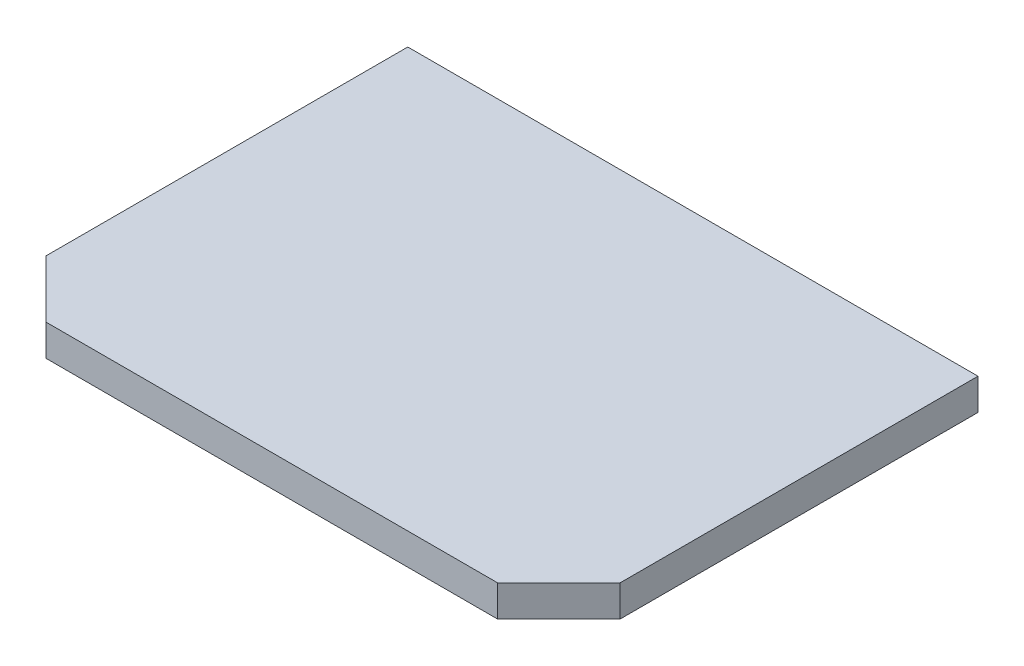
ISO-10303-21;
HEADER;
FILE_DESCRIPTION(('STEP AP214'),'2;1');
FILE_NAME('part.step','',(''),(''),'','','');
FILE_SCHEMA(('AUTOMOTIVE_DESIGN { 1 0 10303 214 1 1 1 1 }'));
ENDSEC;
DATA;
#1=APPLICATION_CONTEXT('core data for automotive mechanical design processes');
#2=APPLICATION_PROTOCOL_DEFINITION('international standard','automotive_design',2000,#1);
#3=PRODUCT_CONTEXT('',#1,'mechanical');
#4=PRODUCT('Part','Part','',(#3));
#5=PRODUCT_RELATED_PRODUCT_CATEGORY('part','',(#4));
#6=PRODUCT_DEFINITION_FORMATION('','',#4);
#7=PRODUCT_DEFINITION_CONTEXT('part definition',#1,'design');
#8=PRODUCT_DEFINITION('design','',#6,#7);
#9=PRODUCT_DEFINITION_SHAPE('','',#8);
#10=(LENGTH_UNIT() NAMED_UNIT(*) SI_UNIT(.MILLI.,.METRE.));
#11=(NAMED_UNIT(*) PLANE_ANGLE_UNIT() SI_UNIT($,.RADIAN.));
#12=(NAMED_UNIT(*) SI_UNIT($,.STERADIAN.) SOLID_ANGLE_UNIT());
#13=UNCERTAINTY_MEASURE_WITH_UNIT(LENGTH_MEASURE(1.E-05),#10,'distance_accuracy_value','');
#14=(GEOMETRIC_REPRESENTATION_CONTEXT(3) GLOBAL_UNCERTAINTY_ASSIGNED_CONTEXT((#13)) GLOBAL_UNIT_ASSIGNED_CONTEXT((#10,
#11,#12)) REPRESENTATION_CONTEXT('',''));
#15=CARTESIAN_POINT('',(0.,0.,0.));
#16=DIRECTION('',(0.,0.,1.));
#17=DIRECTION('',(1.,0.,0.));
#18=AXIS2_PLACEMENT_3D('',#15,#16,#17);
#19=CARTESIAN_POINT('',(-16.127330454661,1.39882293722681E-13,-12.));
#20=DIRECTION('',(-1.,0.,0.));
#21=DIRECTION('',(0.,-1.,0.));
#22=AXIS2_PLACEMENT_3D('',#19,#20,#21);
#23=PLANE('',#22);
#24=DIRECTION('',(0.,0.,1.));
#25=VECTOR('',#24,1.);
#26=CARTESIAN_POINT('',(-16.127330454661,3.2,-12.));
#27=LINE('',#26,#25);
#28=CARTESIAN_POINT('',(-16.127330454661,3.2,-12.));
#29=VERTEX_POINT('',#28);
#30=CARTESIAN_POINT('',(-16.127330454661,3.2,5.124133230369));
#31=VERTEX_POINT('',#30);
#32=EDGE_CURVE('E214',#29,#31,#27,.T.);
#33=ORIENTED_EDGE('',*,*,#32,.T.);
#34=DIRECTION('',(0.,-1.,0.));
#35=VECTOR('',#34,1.);
#36=CARTESIAN_POINT('',(-16.127330454661,1.46050094247165E-13,5.124133230369));
#37=LINE('',#36,#35);
#38=CARTESIAN_POINT('',(-16.127330454661,4.,5.124133230369));
#39=VERTEX_POINT('',#38);
#40=EDGE_CURVE('E171',#39,#31,#37,.T.);
#41=ORIENTED_EDGE('',*,*,#40,.F.);
#42=DIRECTION('',(0.,0.,1.));
#43=VECTOR('',#42,1.);
#44=CARTESIAN_POINT('',(-16.127330454661,4.,-12.));
#45=LINE('',#44,#43);
#46=CARTESIAN_POINT('',(-16.127330454661,4.,-12.));
#47=VERTEX_POINT('',#46);
#48=EDGE_CURVE('E58',#47,#39,#45,.T.);
#49=ORIENTED_EDGE('',*,*,#48,.F.);
#50=DIRECTION('',(0.,-1.,0.));
#51=VECTOR('',#50,1.);
#52=CARTESIAN_POINT('',(-16.127330454661,1.39882293722681E-13,-12.));
#53=LINE('',#52,#51);
#54=EDGE_CURVE('E170',#47,#29,#53,.T.);
#55=ORIENTED_EDGE('',*,*,#54,.T.);
#56=EDGE_LOOP('',(#33,#41,#49,#55));
#57=FACE_BOUND('',#56,.T.);
#58=ADVANCED_FACE('F36',(#57),#23,.T.);
#59=CARTESIAN_POINT('',(0.,4.,-12.));
#60=DIRECTION('',(0.,1.,0.));
#61=DIRECTION('',(0.,0.,1.));
#62=AXIS2_PLACEMENT_3D('',#59,#60,#61);
#63=PLANE('',#62);
#64=ORIENTED_EDGE('',*,*,#48,.T.);
#65=DIRECTION('',(-1.,0.,0.));
#66=VECTOR('',#65,1.);
#67=CARTESIAN_POINT('',(0.,4.,5.124133230369));
#68=LINE('',#67,#66);
#69=CARTESIAN_POINT('',(-11.027330454661,4.,5.124133230369));
#70=VERTEX_POINT('',#69);
#71=EDGE_CURVE('E175',#70,#39,#68,.T.);
#72=ORIENTED_EDGE('',*,*,#71,.F.);
#73=DIRECTION('',(0.,0.,1.));
#74=VECTOR('',#73,1.);
#75=CARTESIAN_POINT('',(-11.027330454661,4.,-12.));
#76=LINE('',#75,#74);
#77=CARTESIAN_POINT('',(-11.027330454661,4.,-12.));
#78=VERTEX_POINT('',#77);
#79=EDGE_CURVE('E216',#78,#70,#76,.T.);
#80=ORIENTED_EDGE('',*,*,#79,.F.);
#81=DIRECTION('',(-1.,0.,0.));
#82=VECTOR('',#81,1.);
#83=CARTESIAN_POINT('',(0.,4.,-12.));
#84=LINE('',#83,#82);
#85=EDGE_CURVE('E211',#78,#47,#84,.T.);
#86=ORIENTED_EDGE('',*,*,#85,.T.);
#87=EDGE_LOOP('',(#64,#72,#80,#86));
#88=FACE_BOUND('',#87,.T.);
#89=ADVANCED_FACE('F292',(#88),#63,.T.);
#90=CARTESIAN_POINT('',(-11.027330454661,0.,-12.));
#91=DIRECTION('',(-1.,0.,0.));
#92=DIRECTION('',(0.,0.,1.));
#93=AXIS2_PLACEMENT_3D('',#90,#91,#92);
#94=PLANE('',#93);
#95=ORIENTED_EDGE('',*,*,#79,.T.);
#96=DIRECTION('',(0.,-1.,0.));
#97=VECTOR('',#96,1.);
#98=CARTESIAN_POINT('',(-11.027330454661,0.,5.124133230369));
#99=LINE('',#98,#97);
#100=CARTESIAN_POINT('',(-11.027330454661,5.1,5.124133230369));
#101=VERTEX_POINT('',#100);
#102=EDGE_CURVE('E167',#101,#70,#99,.T.);
#103=ORIENTED_EDGE('',*,*,#102,.F.);
#104=DIRECTION('',(0.,0.,1.));
#105=VECTOR('',#104,1.);
#106=CARTESIAN_POINT('',(-11.027330454661,5.1,-12.));
#107=LINE('',#106,#105);
#108=CARTESIAN_POINT('',(-11.027330454661,5.1,-12.));
#109=VERTEX_POINT('',#108);
#110=EDGE_CURVE('E218',#109,#101,#107,.T.);
#111=ORIENTED_EDGE('',*,*,#110,.F.);
#112=DIRECTION('',(0.,-1.,0.));
#113=VECTOR('',#112,1.);
#114=CARTESIAN_POINT('',(-11.027330454661,0.,-12.));
#115=LINE('',#114,#113);
#116=EDGE_CURVE('E208',#109,#78,#115,.T.);
#117=ORIENTED_EDGE('',*,*,#116,.T.);
#118=EDGE_LOOP('',(#95,#103,#111,#117));
#119=FACE_BOUND('',#118,.T.);
#120=ADVANCED_FACE('F261',(#119),#94,.T.);
#121=CARTESIAN_POINT('',(0.,5.1,-12.));
#122=DIRECTION('',(0.,1.,0.));
#123=DIRECTION('',(0.,0.,1.));
#124=AXIS2_PLACEMENT_3D('',#121,#122,#123);
#125=PLANE('',#124);
#126=DIRECTION('',(-1.,0.,0.));
#127=VECTOR('',#126,1.);
#128=CARTESIAN_POINT('',(0.,5.1,14.703327406655));
#129=LINE('',#128,#127);
#130=CARTESIAN_POINT('',(14.191406072396,5.1,14.703327406655));
#131=VERTEX_POINT('',#130);
#132=CARTESIAN_POINT('',(-14.5724068344093,5.1,14.703327406655));
#133=VERTEX_POINT('',#132);
#134=EDGE_CURVE('E139',#131,#133,#129,.T.);
#135=ORIENTED_EDGE('',*,*,#134,.T.);
#136=DIRECTION('',(-0.707106781186548,0.,-0.707106781186547));
#137=VECTOR('',#136,1.);
#138=CARTESIAN_POINT('',(-20.6378671205321,5.1,8.63786712053215));
#139=LINE('',#138,#137);
#140=CARTESIAN_POINT('',(-18.227330454661,5.1,11.0484037864033));
#141=VERTEX_POINT('',#140);
#142=EDGE_CURVE('E147',#133,#141,#139,.T.);
#143=ORIENTED_EDGE('',*,*,#142,.T.);
#144=DIRECTION('',(0.,0.,1.));
#145=VECTOR('',#144,1.);
#146=CARTESIAN_POINT('',(-18.227330454661,5.1,-12.));
#147=LINE('',#146,#145);
#148=CARTESIAN_POINT('',(-18.227330454661,5.1,-12.));
#149=VERTEX_POINT('',#148);
#150=EDGE_CURVE('E221',#149,#141,#147,.T.);
#151=ORIENTED_EDGE('',*,*,#150,.F.);
#152=DIRECTION('',(-1.,0.,0.));
#153=VECTOR('',#152,1.);
#154=CARTESIAN_POINT('',(0.,5.1,-12.));
#155=LINE('',#154,#153);
#156=EDGE_CURVE('E206',#109,#149,#155,.T.);
#157=ORIENTED_EDGE('',*,*,#156,.F.);
#158=ORIENTED_EDGE('',*,*,#110,.T.);
#159=DIRECTION('',(1.,0.,0.));
#160=VECTOR('',#159,1.);
#161=CARTESIAN_POINT('',(11.027330454661,5.1,5.124133230369));
#162=LINE('',#161,#160);
#163=CARTESIAN_POINT('',(11.027330454661,5.1,5.124133230369));
#164=VERTEX_POINT('',#163);
#165=EDGE_CURVE('E164',#101,#164,#162,.T.);
#166=ORIENTED_EDGE('',*,*,#165,.T.);
#167=DIRECTION('',(0.,0.,1.));
#168=VECTOR('',#167,1.);
#169=CARTESIAN_POINT('',(11.027330454661,5.1,-12.));
#170=LINE('',#169,#168);
#171=CARTESIAN_POINT('',(11.027330454661,5.1,-12.));
#172=VERTEX_POINT('',#171);
#173=EDGE_CURVE('E228',#172,#164,#170,.T.);
#174=ORIENTED_EDGE('',*,*,#173,.F.);
#175=DIRECTION('',(-1.,0.,0.));
#176=VECTOR('',#175,1.);
#177=CARTESIAN_POINT('',(0.,5.1,-12.));
#178=LINE('',#177,#176);
#179=CARTESIAN_POINT('',(18.10033020066,5.1,-12.));
#180=VERTEX_POINT('',#179);
#181=EDGE_CURVE('E197',#180,#172,#178,.T.);
#182=ORIENTED_EDGE('',*,*,#181,.F.);
#183=DIRECTION('',(0.,0.,1.));
#184=VECTOR('',#183,1.);
#185=CARTESIAN_POINT('',(18.10033020066,5.1,-12.));
#186=LINE('',#185,#184);
#187=CARTESIAN_POINT('',(18.10033020066,5.1,10.7944032784056));
#188=VERTEX_POINT('',#187);
#189=EDGE_CURVE('E50',#180,#188,#186,.T.);
#190=ORIENTED_EDGE('',*,*,#189,.T.);
#191=DIRECTION('',(-0.707106781187862,0.,0.707106781185233));
#192=VECTOR('',#191,1.);
#193=CARTESIAN_POINT('',(20.4473667394991,5.1,8.44736673957516));
#194=LINE('',#193,#192);
#195=EDGE_CURVE('E148',#188,#131,#194,.T.);
#196=ORIENTED_EDGE('',*,*,#195,.T.);
#197=EDGE_LOOP('',(#135,#143,#151,#157,#158,#166,#174,#182,#190,#196));
#198=FACE_BOUND('',#197,.T.);
#199=ADVANCED_FACE('F157',(#198),#125,.F.);
#200=CARTESIAN_POINT('',(-18.227330454661,0.,-12.));
#201=DIRECTION('',(1.,0.,0.));
#202=DIRECTION('',(0.,0.,-1.));
#203=AXIS2_PLACEMENT_3D('',#200,#201,#202);
#204=PLANE('',#203);
#205=DIRECTION('',(0.,1.,0.));
#206=VECTOR('',#205,1.);
#207=CARTESIAN_POINT('',(-18.227330454661,3.2,11.0484037864033));
#208=LINE('',#207,#206);
#209=CARTESIAN_POINT('',(-18.227330454661,7.1,11.0484037864033));
#210=VERTEX_POINT('',#209);
#211=EDGE_CURVE('E159',#141,#210,#208,.T.);
#212=ORIENTED_EDGE('',*,*,#211,.T.);
#213=DIRECTION('',(0.,0.,1.));
#214=VECTOR('',#213,1.);
#215=CARTESIAN_POINT('',(-18.227330454661,7.1,-12.));
#216=LINE('',#215,#214);
#217=CARTESIAN_POINT('',(-18.227330454661,7.1,-12.));
#218=VERTEX_POINT('',#217);
#219=EDGE_CURVE('E223',#218,#210,#216,.T.);
#220=ORIENTED_EDGE('',*,*,#219,.F.);
#221=DIRECTION('',(0.,1.,0.));
#222=VECTOR('',#221,1.);
#223=CARTESIAN_POINT('',(-18.227330454661,0.,-12.));
#224=LINE('',#223,#222);
#225=EDGE_CURVE('E204',#149,#218,#224,.T.);
#226=ORIENTED_EDGE('',*,*,#225,.F.);
#227=ORIENTED_EDGE('',*,*,#150,.T.);
#228=EDGE_LOOP('',(#212,#220,#226,#227));
#229=FACE_BOUND('',#228,.T.);
#230=ADVANCED_FACE('F250',(#229),#204,.F.);
#231=CARTESIAN_POINT('',(0.,7.1,-12.));
#232=DIRECTION('',(0.,-1.,0.));
#233=DIRECTION('',(0.,0.,-1.));
#234=AXIS2_PLACEMENT_3D('',#231,#232,#233);
#235=PLANE('',#234);
#236=ORIENTED_EDGE('',*,*,#219,.T.);
#237=DIRECTION('',(0.707106781186548,0.,0.707106781186547));
#238=VECTOR('',#237,1.);
#239=CARTESIAN_POINT('',(-20.6378671205321,7.1,8.63786712053215));
#240=LINE('',#239,#238);
#241=CARTESIAN_POINT('',(-14.5724068344093,7.1,14.703327406655));
#242=VERTEX_POINT('',#241);
#243=EDGE_CURVE('E12',#210,#242,#240,.T.);
#244=ORIENTED_EDGE('',*,*,#243,.T.);
#245=DIRECTION('',(1.,0.,0.));
#246=VECTOR('',#245,1.);
#247=CARTESIAN_POINT('',(0.,7.1,14.703327406655));
#248=LINE('',#247,#246);
#249=CARTESIAN_POINT('',(14.191406072396,7.1,14.703327406655));
#250=VERTEX_POINT('',#249);
#251=EDGE_CURVE('E43',#242,#250,#248,.T.);
#252=ORIENTED_EDGE('',*,*,#251,.T.);
#253=DIRECTION('',(0.707106781187862,0.,-0.707106781185233));
#254=VECTOR('',#253,1.);
#255=CARTESIAN_POINT('',(20.4473667394991,7.1,8.44736673957516));
#256=LINE('',#255,#254);
#257=CARTESIAN_POINT('',(18.10033020066,7.1,10.7944032784056));
#258=VERTEX_POINT('',#257);
#259=EDGE_CURVE('E155',#250,#258,#256,.T.);
#260=ORIENTED_EDGE('',*,*,#259,.T.);
#261=DIRECTION('',(0.,0.,1.));
#262=VECTOR('',#261,1.);
#263=CARTESIAN_POINT('',(18.10033020066,7.1,-12.));
#264=LINE('',#263,#262);
#265=CARTESIAN_POINT('',(18.10033020066,7.1,-12.));
#266=VERTEX_POINT('',#265);
#267=EDGE_CURVE('E225',#266,#258,#264,.T.);
#268=ORIENTED_EDGE('',*,*,#267,.F.);
#269=DIRECTION('',(1.,0.,0.));
#270=VECTOR('',#269,1.);
#271=CARTESIAN_POINT('',(0.,7.1,-12.));
#272=LINE('',#271,#270);
#273=EDGE_CURVE('E202',#218,#266,#272,.T.);
#274=ORIENTED_EDGE('',*,*,#273,.F.);
#275=EDGE_LOOP('',(#236,#244,#252,#260,#268,#274));
#276=FACE_BOUND('',#275,.T.);
#277=ADVANCED_FACE('F239',(#276),#235,.F.);
#278=CARTESIAN_POINT('',(18.10033020066,0.,-12.));
#279=DIRECTION('',(1.,0.,0.));
#280=DIRECTION('',(0.,0.,-1.));
#281=AXIS2_PLACEMENT_3D('',#278,#279,#280);
#282=PLANE('',#281);
#283=DIRECTION('',(0.,1.,0.));
#284=VECTOR('',#283,1.);
#285=CARTESIAN_POINT('',(18.10033020066,0.,10.7944032784056));
#286=LINE('',#285,#284);
#287=EDGE_CURVE('E166',#188,#258,#286,.T.);
#288=ORIENTED_EDGE('',*,*,#287,.F.);
#289=ORIENTED_EDGE('',*,*,#189,.F.);
#290=DIRECTION('',(0.,1.,0.));
#291=VECTOR('',#290,1.);
#292=CARTESIAN_POINT('',(18.10033020066,0.,-12.));
#293=LINE('',#292,#291);
#294=EDGE_CURVE('E199',#180,#266,#293,.T.);
#295=ORIENTED_EDGE('',*,*,#294,.T.);
#296=ORIENTED_EDGE('',*,*,#267,.T.);
#297=EDGE_LOOP('',(#288,#289,#295,#296));
#298=FACE_BOUND('',#297,.T.);
#299=ADVANCED_FACE('F282',(#298),#282,.T.);
#300=CARTESIAN_POINT('',(11.027330454661,0.,-12.));
#301=DIRECTION('',(-1.,0.,0.));
#302=DIRECTION('',(0.,0.,1.));
#303=AXIS2_PLACEMENT_3D('',#300,#301,#302);
#304=PLANE('',#303);
#305=ORIENTED_EDGE('',*,*,#173,.T.);
#306=DIRECTION('',(0.,-1.,0.));
#307=VECTOR('',#306,1.);
#308=CARTESIAN_POINT('',(11.027330454661,0.,5.124133230369));
#309=LINE('',#308,#307);
#310=CARTESIAN_POINT('',(11.027330454661,4.,5.124133230369));
#311=VERTEX_POINT('',#310);
#312=EDGE_CURVE('E172',#164,#311,#309,.T.);
#313=ORIENTED_EDGE('',*,*,#312,.T.);
#314=DIRECTION('',(0.,0.,1.));
#315=VECTOR('',#314,1.);
#316=CARTESIAN_POINT('',(11.027330454661,4.,-12.));
#317=LINE('',#316,#315);
#318=CARTESIAN_POINT('',(11.027330454661,4.,-12.));
#319=VERTEX_POINT('',#318);
#320=EDGE_CURVE('E231',#319,#311,#317,.T.);
#321=ORIENTED_EDGE('',*,*,#320,.F.);
#322=DIRECTION('',(0.,-1.,0.));
#323=VECTOR('',#322,1.);
#324=CARTESIAN_POINT('',(11.027330454661,0.,-12.));
#325=LINE('',#324,#323);
#326=EDGE_CURVE('E195',#172,#319,#325,.T.);
#327=ORIENTED_EDGE('',*,*,#326,.F.);
#328=EDGE_LOOP('',(#305,#313,#321,#327));
#329=FACE_BOUND('',#328,.T.);
#330=ADVANCED_FACE('F269',(#329),#304,.F.);
#331=CARTESIAN_POINT('',(0.,4.,-12.));
#332=DIRECTION('',(0.,-1.,0.));
#333=DIRECTION('',(0.,0.,-1.));
#334=AXIS2_PLACEMENT_3D('',#331,#332,#333);
#335=PLANE('',#334);
#336=ORIENTED_EDGE('',*,*,#320,.T.);
#337=DIRECTION('',(1.,0.,0.));
#338=VECTOR('',#337,1.);
#339=CARTESIAN_POINT('',(0.,4.,5.124133230369));
#340=LINE('',#339,#338);
#341=CARTESIAN_POINT('',(16.1277581912354,4.,5.124133230369));
#342=VERTEX_POINT('',#341);
#343=EDGE_CURVE('E176',#311,#342,#340,.T.);
#344=ORIENTED_EDGE('',*,*,#343,.T.);
#345=DIRECTION('',(0.,0.,1.));
#346=VECTOR('',#345,1.);
#347=CARTESIAN_POINT('',(16.1277581912354,4.,-12.));
#348=LINE('',#347,#346);
#349=CARTESIAN_POINT('',(16.1277581912354,4.,-12.));
#350=VERTEX_POINT('',#349);
#351=EDGE_CURVE('E233',#350,#342,#348,.T.);
#352=ORIENTED_EDGE('',*,*,#351,.F.);
#353=DIRECTION('',(1.,0.,0.));
#354=VECTOR('',#353,1.);
#355=CARTESIAN_POINT('',(0.,4.,-12.));
#356=LINE('',#355,#354);
#357=EDGE_CURVE('E193',#319,#350,#356,.T.);
#358=ORIENTED_EDGE('',*,*,#357,.F.);
#359=EDGE_LOOP('',(#336,#344,#352,#358));
#360=FACE_BOUND('',#359,.T.);
#361=ADVANCED_FACE('F277',(#360),#335,.F.);
#362=CARTESIAN_POINT('',(16.1277581912354,0.,-12.));
#363=DIRECTION('',(-1.,0.,0.));
#364=DIRECTION('',(0.,0.,1.));
#365=AXIS2_PLACEMENT_3D('',#362,#363,#364);
#366=PLANE('',#365);
#367=ORIENTED_EDGE('',*,*,#351,.T.);
#368=DIRECTION('',(0.,-1.,0.));
#369=VECTOR('',#368,1.);
#370=CARTESIAN_POINT('',(16.1277581912354,0.,5.124133230369));
#371=LINE('',#370,#369);
#372=CARTESIAN_POINT('',(16.1277581912354,3.20000006895067,5.124133230369));
#373=VERTEX_POINT('',#372);
#374=EDGE_CURVE('E179',#342,#373,#371,.T.);
#375=ORIENTED_EDGE('',*,*,#374,.T.);
#376=DIRECTION('',(0.,0.,1.));
#377=VECTOR('',#376,1.);
#378=CARTESIAN_POINT('',(16.1277581912354,3.20000006895067,-12.));
#379=LINE('',#378,#377);
#380=CARTESIAN_POINT('',(16.1277581912354,3.20000006895067,-12.));
#381=VERTEX_POINT('',#380);
#382=EDGE_CURVE('E235',#381,#373,#379,.T.);
#383=ORIENTED_EDGE('',*,*,#382,.F.);
#384=DIRECTION('',(0.,-1.,0.));
#385=VECTOR('',#384,1.);
#386=CARTESIAN_POINT('',(16.1277581912354,0.,-12.));
#387=LINE('',#386,#385);
#388=EDGE_CURVE('E191',#350,#381,#387,.T.);
#389=ORIENTED_EDGE('',*,*,#388,.F.);
#390=EDGE_LOOP('',(#367,#375,#383,#389));
#391=FACE_BOUND('',#390,.T.);
#392=ADVANCED_FACE('F303',(#391),#366,.F.);
#393=CARTESIAN_POINT('',(0.,3.2,-12.));
#394=DIRECTION('',(0.,1.,0.));
#395=DIRECTION('',(-1.,0.,0.));
#396=AXIS2_PLACEMENT_3D('',#393,#394,#395);
#397=PLANE('',#396);
#398=ORIENTED_EDGE('',*,*,#382,.T.);
#399=DIRECTION('',(-1.,0.,0.));
#400=VECTOR('',#399,1.);
#401=CARTESIAN_POINT('',(0.,3.2,5.124133230369));
#402=LINE('',#401,#400);
#403=EDGE_CURVE('E163',#373,#31,#402,.T.);
#404=ORIENTED_EDGE('',*,*,#403,.T.);
#405=ORIENTED_EDGE('',*,*,#32,.F.);
#406=DIRECTION('',(-1.,0.,0.));
#407=VECTOR('',#406,1.);
#408=CARTESIAN_POINT('',(0.,3.2,-12.));
#409=LINE('',#408,#407);
#410=EDGE_CURVE('E189',#381,#29,#409,.T.);
#411=ORIENTED_EDGE('',*,*,#410,.F.);
#412=EDGE_LOOP('',(#398,#404,#405,#411));
#413=FACE_BOUND('',#412,.T.);
#414=ADVANCED_FACE('F301',(#413),#397,.F.);
#415=CARTESIAN_POINT('',(0.,0.,-12.));
#416=DIRECTION('',(0.,0.,1.));
#417=DIRECTION('',(1.,0.,0.));
#418=AXIS2_PLACEMENT_3D('',#415,#416,#417);
#419=PLANE('',#418);
#420=ORIENTED_EDGE('',*,*,#54,.F.);
#421=ORIENTED_EDGE('',*,*,#85,.F.);
#422=ORIENTED_EDGE('',*,*,#116,.F.);
#423=ORIENTED_EDGE('',*,*,#156,.T.);
#424=ORIENTED_EDGE('',*,*,#225,.T.);
#425=ORIENTED_EDGE('',*,*,#273,.T.);
#426=ORIENTED_EDGE('',*,*,#294,.F.);
#427=ORIENTED_EDGE('',*,*,#181,.T.);
#428=ORIENTED_EDGE('',*,*,#326,.T.);
#429=ORIENTED_EDGE('',*,*,#357,.T.);
#430=ORIENTED_EDGE('',*,*,#388,.T.);
#431=ORIENTED_EDGE('',*,*,#410,.T.);
#432=EDGE_LOOP('',(#420,#421,#422,#423,#424,#425,#426,#427,#428,#429,#430,#431));
#433=FACE_BOUND('',#432,.T.);
#434=ADVANCED_FACE('F257',(#433),#419,.F.);
#435=CARTESIAN_POINT('',(4.209296418593,4.675627600025,5.124133230369));
#436=DIRECTION('',(0.,0.,1.));
#437=DIRECTION('',(-1.,0.,0.));
#438=AXIS2_PLACEMENT_3D('',#435,#436,#437);
#439=PLANE('',#438);
#440=ORIENTED_EDGE('',*,*,#165,.F.);
#441=ORIENTED_EDGE('',*,*,#102,.T.);
#442=ORIENTED_EDGE('',*,*,#71,.T.);
#443=ORIENTED_EDGE('',*,*,#40,.T.);
#444=ORIENTED_EDGE('',*,*,#403,.F.);
#445=ORIENTED_EDGE('',*,*,#374,.F.);
#446=ORIENTED_EDGE('',*,*,#343,.F.);
#447=ORIENTED_EDGE('',*,*,#312,.F.);
#448=EDGE_LOOP('',(#440,#441,#442,#443,#444,#445,#446,#447));
#449=FACE_BOUND('',#448,.T.);
#450=ADVANCED_FACE('F272',(#449),#439,.T.);
#451=CARTESIAN_POINT('',(-14.6378671205321,3.2,14.6378671205321));
#452=DIRECTION('',(0.707106781186547,0.,-0.707106781186548));
#453=DIRECTION('',(-0.707106781186548,0.,-0.707106781186547));
#454=AXIS2_PLACEMENT_3D('',#451,#452,#453);
#455=PLANE('',#454);
#456=DIRECTION('',(0.,1.,0.));
#457=VECTOR('',#456,1.);
#458=CARTESIAN_POINT('',(-14.5724068344093,3.2,14.703327406655));
#459=LINE('',#458,#457);
#460=EDGE_CURVE('E145',#133,#242,#459,.T.);
#461=ORIENTED_EDGE('',*,*,#460,.T.);
#462=ORIENTED_EDGE('',*,*,#243,.F.);
#463=ORIENTED_EDGE('',*,*,#211,.F.);
#464=ORIENTED_EDGE('',*,*,#142,.F.);
#465=EDGE_LOOP('',(#461,#462,#463,#464));
#466=FACE_BOUND('',#465,.T.);
#467=ADVANCED_FACE('F243',(#466),#455,.F.);
#468=CARTESIAN_POINT('',(0.,3.2,14.703327406655));
#469=DIRECTION('',(0.,0.,-1.));
#470=DIRECTION('',(-1.,0.,0.));
#471=AXIS2_PLACEMENT_3D('',#468,#469,#470);
#472=PLANE('',#471);
#473=DIRECTION('',(0.,1.,0.));
#474=VECTOR('',#473,1.);
#475=CARTESIAN_POINT('',(14.191406072396,3.2,14.703327406655));
#476=LINE('',#475,#474);
#477=EDGE_CURVE('E142',#131,#250,#476,.T.);
#478=ORIENTED_EDGE('',*,*,#477,.T.);
#479=ORIENTED_EDGE('',*,*,#251,.F.);
#480=ORIENTED_EDGE('',*,*,#460,.F.);
#481=ORIENTED_EDGE('',*,*,#134,.F.);
#482=EDGE_LOOP('',(#478,#479,#480,#481));
#483=FACE_BOUND('',#482,.T.);
#484=ADVANCED_FACE('F141',(#483),#472,.F.);
#485=CARTESIAN_POINT('',(14.4473667394991,3.2,14.4473667395528));
#486=DIRECTION('',(-0.707106781185233,0.,-0.707106781187862));
#487=DIRECTION('',(-0.707106781187862,0.,0.707106781185233));
#488=AXIS2_PLACEMENT_3D('',#485,#486,#487);
#489=PLANE('',#488);
#490=ORIENTED_EDGE('',*,*,#287,.T.);
#491=ORIENTED_EDGE('',*,*,#259,.F.);
#492=ORIENTED_EDGE('',*,*,#477,.F.);
#493=ORIENTED_EDGE('',*,*,#195,.F.);
#494=EDGE_LOOP('',(#490,#491,#492,#493));
#495=FACE_BOUND('',#494,.T.);
#496=ADVANCED_FACE('F152',(#495),#489,.F.);
#497=CLOSED_SHELL('',(#58,#89,#120,#199,#230,#277,#299,#330,#361,#392,#414,#434,#450,#467,#484,#496));
#498=MANIFOLD_SOLID_BREP('B2',#497);
#499=ADVANCED_BREP_SHAPE_REPRESENTATION('',(#18,#498),#14);
#500=SHAPE_DEFINITION_REPRESENTATION(#9,#499);
ENDSEC;
END-ISO-10303-21;
